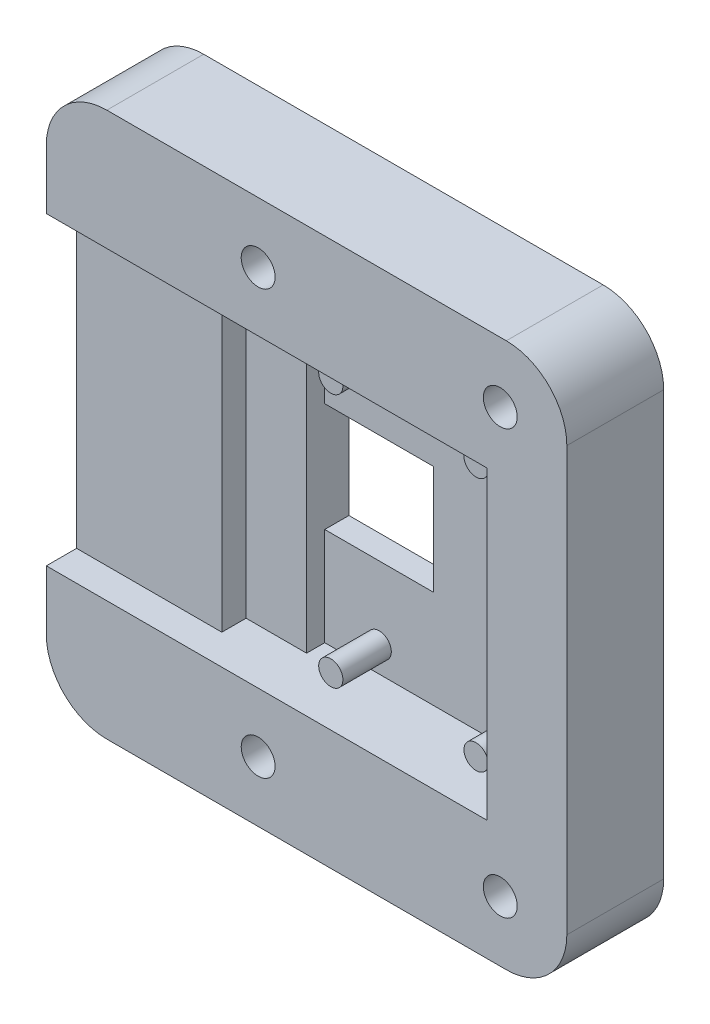
ISO-10303-21;
HEADER;
FILE_DESCRIPTION(('STEP AP214'),'2;1');
FILE_NAME('part.step','',(''),(''),'','','');
FILE_SCHEMA(('AUTOMOTIVE_DESIGN { 1 0 10303 214 1 1 1 1 }'));
ENDSEC;
DATA;
#1=APPLICATION_CONTEXT('core data for automotive mechanical design processes');
#2=APPLICATION_PROTOCOL_DEFINITION('international standard','automotive_design',2000,#1);
#3=PRODUCT_CONTEXT('',#1,'mechanical');
#4=PRODUCT('Part','Part','',(#3));
#5=PRODUCT_RELATED_PRODUCT_CATEGORY('part','',(#4));
#6=PRODUCT_DEFINITION_FORMATION('','',#4);
#7=PRODUCT_DEFINITION_CONTEXT('part definition',#1,'design');
#8=PRODUCT_DEFINITION('design','',#6,#7);
#9=PRODUCT_DEFINITION_SHAPE('','',#8);
#10=(LENGTH_UNIT() NAMED_UNIT(*) SI_UNIT(.MILLI.,.METRE.));
#11=(NAMED_UNIT(*) PLANE_ANGLE_UNIT() SI_UNIT($,.RADIAN.));
#12=(NAMED_UNIT(*) SI_UNIT($,.STERADIAN.) SOLID_ANGLE_UNIT());
#13=UNCERTAINTY_MEASURE_WITH_UNIT(LENGTH_MEASURE(1.E-05),#10,'distance_accuracy_value','');
#14=(GEOMETRIC_REPRESENTATION_CONTEXT(3) GLOBAL_UNCERTAINTY_ASSIGNED_CONTEXT((#13)) GLOBAL_UNIT_ASSIGNED_CONTEXT((#10,
#11,#12)) REPRESENTATION_CONTEXT('',''));
#15=CARTESIAN_POINT('',(0.,0.,0.));
#16=DIRECTION('',(0.,0.,1.));
#17=DIRECTION('',(1.,0.,0.));
#18=AXIS2_PLACEMENT_3D('',#15,#16,#17);
#19=CARTESIAN_POINT('',(0.,0.,3.5));
#20=DIRECTION('',(0.,0.,1.));
#21=DIRECTION('',(1.,0.,0.));
#22=AXIS2_PLACEMENT_3D('',#19,#20,#21);
#23=PLANE('',#22);
#24=DIRECTION('',(-1.,0.,0.));
#25=VECTOR('',#24,1.);
#26=CARTESIAN_POINT('',(0.,12.6,3.5));
#27=LINE('',#26,#25);
#28=CARTESIAN_POINT('',(-10.5,12.6,3.5));
#29=VERTEX_POINT('',#28);
#30=CARTESIAN_POINT('',(-15.5,12.6,3.5));
#31=VERTEX_POINT('',#30);
#32=EDGE_CURVE('E388',#29,#31,#27,.T.);
#33=ORIENTED_EDGE('',*,*,#32,.T.);
#34=DIRECTION('',(0.,1.,0.));
#35=VECTOR('',#34,1.);
#36=CARTESIAN_POINT('',(-15.5,12.6,3.5));
#37=LINE('',#36,#35);
#38=CARTESIAN_POINT('',(-15.5,-12.6,3.5));
#39=VERTEX_POINT('',#38);
#40=EDGE_CURVE('E952',#39,#31,#37,.T.);
#41=ORIENTED_EDGE('',*,*,#40,.F.);
#42=DIRECTION('',(1.,0.,0.));
#43=VECTOR('',#42,1.);
#44=CARTESIAN_POINT('',(0.,-12.6,3.5));
#45=LINE('',#44,#43);
#46=CARTESIAN_POINT('',(-10.5,-12.6,3.5));
#47=VERTEX_POINT('',#46);
#48=EDGE_CURVE('E209',#39,#47,#45,.T.);
#49=ORIENTED_EDGE('',*,*,#48,.T.);
#50=DIRECTION('',(0.,1.,0.));
#51=VECTOR('',#50,1.);
#52=CARTESIAN_POINT('',(-10.5,22.5,3.5));
#53=LINE('',#52,#51);
#54=EDGE_CURVE('E316',#47,#29,#53,.T.);
#55=ORIENTED_EDGE('',*,*,#54,.T.);
#56=EDGE_LOOP('',(#33,#41,#49,#55));
#57=FACE_BOUND('',#56,.T.);
#58=ADVANCED_FACE('F44',(#57),#23,.T.);
#59=CARTESIAN_POINT('',(8.9,12.6,8.));
#60=DIRECTION('',(0.,1.,0.));
#61=DIRECTION('',(-1.,0.,0.));
#62=AXIS2_PLACEMENT_3D('',#59,#60,#61);
#63=PLANE('',#62);
#64=DIRECTION('',(0.,0.,-1.));
#65=VECTOR('',#64,1.);
#66=CARTESIAN_POINT('',(-15.5,12.6,5.5));
#67=LINE('',#66,#65);
#68=CARTESIAN_POINT('',(-15.5,12.6,5.5));
#69=VERTEX_POINT('',#68);
#70=EDGE_CURVE('E201',#69,#31,#67,.T.);
#71=ORIENTED_EDGE('',*,*,#70,.T.);
#72=ORIENTED_EDGE('',*,*,#32,.F.);
#73=DIRECTION('',(0.,0.,1.));
#74=VECTOR('',#73,1.);
#75=CARTESIAN_POINT('',(-10.5,12.6,2.));
#76=LINE('',#75,#74);
#77=CARTESIAN_POINT('',(-10.5,12.6,2.));
#78=VERTEX_POINT('',#77);
#79=EDGE_CURVE('E312',#78,#29,#76,.T.);
#80=ORIENTED_EDGE('',*,*,#79,.F.);
#81=DIRECTION('',(1.,0.,0.));
#82=VECTOR('',#81,1.);
#83=CARTESIAN_POINT('',(8.9,12.6,2.));
#84=LINE('',#83,#82);
#85=CARTESIAN_POINT('',(8.9,12.6,2.));
#86=VERTEX_POINT('',#85);
#87=EDGE_CURVE('E256',#78,#86,#84,.T.);
#88=ORIENTED_EDGE('',*,*,#87,.T.);
#89=DIRECTION('',(0.,0.,-1.));
#90=VECTOR('',#89,1.);
#91=CARTESIAN_POINT('',(8.9,12.6,8.));
#92=LINE('',#91,#90);
#93=CARTESIAN_POINT('',(8.9,12.6,8.));
#94=VERTEX_POINT('',#93);
#95=EDGE_CURVE('E301',#94,#86,#92,.T.);
#96=ORIENTED_EDGE('',*,*,#95,.F.);
#97=DIRECTION('',(1.,0.,0.));
#98=VECTOR('',#97,1.);
#99=CARTESIAN_POINT('',(-27.5,12.6,8.));
#100=LINE('',#99,#98);
#101=CARTESIAN_POINT('',(-27.5,12.6,8.));
#102=VERTEX_POINT('',#101);
#103=EDGE_CURVE('E269',#102,#94,#100,.T.);
#104=ORIENTED_EDGE('',*,*,#103,.F.);
#105=DIRECTION('',(0.,0.,-1.));
#106=VECTOR('',#105,1.);
#107=CARTESIAN_POINT('',(-27.5,12.6,8.));
#108=LINE('',#107,#106);
#109=CARTESIAN_POINT('',(-27.5,12.6,5.5));
#110=VERTEX_POINT('',#109);
#111=EDGE_CURVE('E305',#102,#110,#108,.T.);
#112=ORIENTED_EDGE('',*,*,#111,.T.);
#113=DIRECTION('',(-1.,0.,0.));
#114=VECTOR('',#113,1.);
#115=CARTESIAN_POINT('',(-27.5,12.6,5.5));
#116=LINE('',#115,#114);
#117=EDGE_CURVE('E204',#69,#110,#116,.T.);
#118=ORIENTED_EDGE('',*,*,#117,.F.);
#119=EDGE_LOOP('',(#71,#72,#80,#88,#96,#104,#112,#118));
#120=FACE_BOUND('',#119,.T.);
#121=ADVANCED_FACE('F500',(#120),#63,.F.);
#122=CARTESIAN_POINT('',(-27.5,-12.6,8.));
#123=DIRECTION('',(0.,-1.,0.));
#124=DIRECTION('',(1.,0.,0.));
#125=AXIS2_PLACEMENT_3D('',#122,#123,#124);
#126=PLANE('',#125);
#127=DIRECTION('',(0.,0.,-1.));
#128=VECTOR('',#127,1.);
#129=CARTESIAN_POINT('',(-15.5,-12.6,5.5));
#130=LINE('',#129,#128);
#131=CARTESIAN_POINT('',(-15.5,-12.6,5.5));
#132=VERTEX_POINT('',#131);
#133=EDGE_CURVE('E198',#132,#39,#130,.T.);
#134=ORIENTED_EDGE('',*,*,#133,.F.);
#135=DIRECTION('',(1.,0.,0.));
#136=VECTOR('',#135,1.);
#137=CARTESIAN_POINT('',(-27.5,-12.6,5.5));
#138=LINE('',#137,#136);
#139=CARTESIAN_POINT('',(-27.5,-12.6,5.5));
#140=VERTEX_POINT('',#139);
#141=EDGE_CURVE('E183',#140,#132,#138,.T.);
#142=ORIENTED_EDGE('',*,*,#141,.F.);
#143=DIRECTION('',(0.,0.,-1.));
#144=VECTOR('',#143,1.);
#145=CARTESIAN_POINT('',(-27.5,-12.6,8.));
#146=LINE('',#145,#144);
#147=CARTESIAN_POINT('',(-27.5,-12.6,8.));
#148=VERTEX_POINT('',#147);
#149=EDGE_CURVE('E284',#148,#140,#146,.T.);
#150=ORIENTED_EDGE('',*,*,#149,.F.);
#151=DIRECTION('',(-1.,0.,0.));
#152=VECTOR('',#151,1.);
#153=CARTESIAN_POINT('',(8.9,-12.6,8.));
#154=LINE('',#153,#152);
#155=CARTESIAN_POINT('',(8.9,-12.6,8.));
#156=VERTEX_POINT('',#155);
#157=EDGE_CURVE('E275',#156,#148,#154,.T.);
#158=ORIENTED_EDGE('',*,*,#157,.F.);
#159=DIRECTION('',(0.,0.,-1.));
#160=VECTOR('',#159,1.);
#161=CARTESIAN_POINT('',(8.9,-12.6,8.));
#162=LINE('',#161,#160);
#163=CARTESIAN_POINT('',(8.9,-12.5999999999999,2.));
#164=VERTEX_POINT('',#163);
#165=EDGE_CURVE('E297',#156,#164,#162,.T.);
#166=ORIENTED_EDGE('',*,*,#165,.T.);
#167=DIRECTION('',(-1.,0.,0.));
#168=VECTOR('',#167,1.);
#169=CARTESIAN_POINT('',(-27.5,-12.6,2.));
#170=LINE('',#169,#168);
#171=CARTESIAN_POINT('',(-10.5,-12.5999999999999,2.));
#172=VERTEX_POINT('',#171);
#173=EDGE_CURVE('E262',#164,#172,#170,.T.);
#174=ORIENTED_EDGE('',*,*,#173,.T.);
#175=DIRECTION('',(0.,0.,-1.));
#176=VECTOR('',#175,1.);
#177=CARTESIAN_POINT('',(-10.5,-12.6,2.));
#178=LINE('',#177,#176);
#179=EDGE_CURVE('E309',#47,#172,#178,.T.);
#180=ORIENTED_EDGE('',*,*,#179,.F.);
#181=ORIENTED_EDGE('',*,*,#48,.F.);
#182=EDGE_LOOP('',(#134,#142,#150,#158,#166,#174,#180,#181));
#183=FACE_BOUND('',#182,.T.);
#184=ADVANCED_FACE('F207',(#183),#126,.F.);
#185=CARTESIAN_POINT('',(-10.5,0.,2.));
#186=DIRECTION('',(1.,0.,0.));
#187=DIRECTION('',(0.,1.,0.));
#188=AXIS2_PLACEMENT_3D('',#185,#186,#187);
#189=PLANE('',#188);
#190=DIRECTION('',(0.,1.,0.));
#191=VECTOR('',#190,1.);
#192=CARTESIAN_POINT('',(-10.5,22.5,2.));
#193=LINE('',#192,#191);
#194=CARTESIAN_POINT('',(-10.5,4.5,2.));
#195=VERTEX_POINT('',#194);
#196=EDGE_CURVE('E323',#195,#78,#193,.T.);
#197=ORIENTED_EDGE('',*,*,#196,.T.);
#198=ORIENTED_EDGE('',*,*,#79,.T.);
#199=ORIENTED_EDGE('',*,*,#54,.F.);
#200=ORIENTED_EDGE('',*,*,#179,.T.);
#201=CARTESIAN_POINT('',(-10.5,-4.5,2.));
#202=VERTEX_POINT('',#201);
#203=EDGE_CURVE('E315',#172,#202,#193,.T.);
#204=ORIENTED_EDGE('',*,*,#203,.T.);
#205=DIRECTION('',(0.,0.,-1.));
#206=VECTOR('',#205,1.);
#207=CARTESIAN_POINT('',(-10.5,-4.5,2.));
#208=LINE('',#207,#206);
#209=CARTESIAN_POINT('',(-10.5,-4.5,0.));
#210=VERTEX_POINT('',#209);
#211=EDGE_CURVE('E376',#202,#210,#208,.T.);
#212=ORIENTED_EDGE('',*,*,#211,.T.);
#213=DIRECTION('',(0.,-1.,0.));
#214=VECTOR('',#213,1.);
#215=CARTESIAN_POINT('',(-10.5,0.,0.));
#216=LINE('',#215,#214);
#217=CARTESIAN_POINT('',(-10.5,4.5,0.));
#218=VERTEX_POINT('',#217);
#219=EDGE_CURVE('E356',#218,#210,#216,.T.);
#220=ORIENTED_EDGE('',*,*,#219,.F.);
#221=DIRECTION('',(0.,0.,-1.));
#222=VECTOR('',#221,1.);
#223=CARTESIAN_POINT('',(-10.5,4.5,2.));
#224=LINE('',#223,#222);
#225=EDGE_CURVE('E344',#195,#218,#224,.T.);
#226=ORIENTED_EDGE('',*,*,#225,.F.);
#227=EDGE_LOOP('',(#197,#198,#199,#200,#204,#212,#220,#226));
#228=FACE_BOUND('',#227,.T.);
#229=ADVANCED_FACE('F531',(#228),#189,.T.);
#230=CARTESIAN_POINT('',(0.,0.,2.));
#231=DIRECTION('',(0.,0.,1.));
#232=DIRECTION('',(1.,0.,0.));
#233=AXIS2_PLACEMENT_3D('',#230,#231,#232);
#234=PLANE('',#233);
#235=CARTESIAN_POINT('',(6.,10.5,2.));
#236=DIRECTION('',(0.,0.,1.));
#237=DIRECTION('',(1.,0.,0.));
#238=AXIS2_PLACEMENT_3D('',#235,#236,#237);
#239=CIRCLE('',#238,1.);
#240=CARTESIAN_POINT('',(7.,10.5,2.));
#241=VERTEX_POINT('',#240);
#242=EDGE_CURVE('E248',#241,#241,#239,.T.);
#243=ORIENTED_EDGE('',*,*,#242,.F.);
#244=EDGE_LOOP('',(#243));
#245=FACE_BOUND('',#244,.T.);
#246=CARTESIAN_POINT('',(-6.,10.5,2.));
#247=DIRECTION('',(0.,0.,1.));
#248=DIRECTION('',(1.,0.,0.));
#249=AXIS2_PLACEMENT_3D('',#246,#247,#248);
#250=CIRCLE('',#249,1.);
#251=CARTESIAN_POINT('',(-5.,10.5,2.));
#252=VERTEX_POINT('',#251);
#253=EDGE_CURVE('E324',#252,#252,#250,.T.);
#254=ORIENTED_EDGE('',*,*,#253,.F.);
#255=EDGE_LOOP('',(#254));
#256=FACE_BOUND('',#255,.T.);
#257=CARTESIAN_POINT('',(6.,-10.5,2.));
#258=DIRECTION('',(0.,0.,1.));
#259=DIRECTION('',(1.,0.,0.));
#260=AXIS2_PLACEMENT_3D('',#257,#258,#259);
#261=CIRCLE('',#260,1.);
#262=CARTESIAN_POINT('',(7.,-10.5,2.));
#263=VERTEX_POINT('',#262);
#264=EDGE_CURVE('E340',#263,#263,#261,.T.);
#265=ORIENTED_EDGE('',*,*,#264,.F.);
#266=EDGE_LOOP('',(#265));
#267=FACE_BOUND('',#266,.T.);
#268=CARTESIAN_POINT('',(-6.,-10.5,2.));
#269=DIRECTION('',(0.,0.,1.));
#270=DIRECTION('',(1.,0.,0.));
#271=AXIS2_PLACEMENT_3D('',#268,#269,#270);
#272=CIRCLE('',#271,1.);
#273=CARTESIAN_POINT('',(-5.,-10.5,2.));
#274=VERTEX_POINT('',#273);
#275=EDGE_CURVE('E240',#274,#274,#272,.T.);
#276=ORIENTED_EDGE('',*,*,#275,.F.);
#277=EDGE_LOOP('',(#276));
#278=FACE_BOUND('',#277,.T.);
#279=DIRECTION('',(0.,-1.,0.));
#280=VECTOR('',#279,1.);
#281=CARTESIAN_POINT('',(8.9,12.6,2.));
#282=LINE('',#281,#280);
#283=EDGE_CURVE('E288',#86,#164,#282,.T.);
#284=ORIENTED_EDGE('',*,*,#283,.F.);
#285=ORIENTED_EDGE('',*,*,#87,.F.);
#286=ORIENTED_EDGE('',*,*,#196,.F.);
#287=DIRECTION('',(1.,0.,0.));
#288=VECTOR('',#287,1.);
#289=CARTESIAN_POINT('',(0.,4.5,2.));
#290=LINE('',#289,#288);
#291=CARTESIAN_POINT('',(-1.5,4.5,2.));
#292=VERTEX_POINT('',#291);
#293=EDGE_CURVE('E328',#195,#292,#290,.T.);
#294=ORIENTED_EDGE('',*,*,#293,.T.);
#295=DIRECTION('',(0.,-1.,0.));
#296=VECTOR('',#295,1.);
#297=CARTESIAN_POINT('',(-1.5,0.,2.));
#298=LINE('',#297,#296);
#299=CARTESIAN_POINT('',(-1.5,-4.5,2.));
#300=VERTEX_POINT('',#299);
#301=EDGE_CURVE('E333',#292,#300,#298,.T.);
#302=ORIENTED_EDGE('',*,*,#301,.T.);
#303=DIRECTION('',(1.,0.,0.));
#304=VECTOR('',#303,1.);
#305=CARTESIAN_POINT('',(0.,-4.5,2.));
#306=LINE('',#305,#304);
#307=EDGE_CURVE('E336',#202,#300,#306,.T.);
#308=ORIENTED_EDGE('',*,*,#307,.F.);
#309=ORIENTED_EDGE('',*,*,#203,.F.);
#310=ORIENTED_EDGE('',*,*,#173,.F.);
#311=EDGE_LOOP('',(#284,#285,#286,#294,#302,#308,#309,#310));
#312=FACE_BOUND('',#311,.T.);
#313=ADVANCED_FACE('F528',(#245,#256,#267,#278,#312),#234,.T.);
#314=CARTESIAN_POINT('',(-27.5,0.,2.));
#315=DIRECTION('',(1.,0.,0.));
#316=DIRECTION('',(0.,1.,0.));
#317=AXIS2_PLACEMENT_3D('',#314,#315,#316);
#318=PLANE('',#317);
#319=DIRECTION('',(0.,-1.,0.));
#320=VECTOR('',#319,1.);
#321=CARTESIAN_POINT('',(-27.5,22.5,8.));
#322=LINE('',#321,#320);
#323=CARTESIAN_POINT('',(-27.5,17.5,8.));
#324=VERTEX_POINT('',#323);
#325=EDGE_CURVE('E266',#324,#102,#322,.T.);
#326=ORIENTED_EDGE('',*,*,#325,.F.);
#327=DIRECTION('',(0.,0.,-1.));
#328=VECTOR('',#327,1.);
#329=CARTESIAN_POINT('',(-27.5,17.5,0.));
#330=LINE('',#329,#328);
#331=CARTESIAN_POINT('',(-27.5,17.5,0.));
#332=VERTEX_POINT('',#331);
#333=EDGE_CURVE('E427',#324,#332,#330,.T.);
#334=ORIENTED_EDGE('',*,*,#333,.T.);
#335=DIRECTION('',(0.,-1.,0.));
#336=VECTOR('',#335,1.);
#337=CARTESIAN_POINT('',(-27.5,0.,0.));
#338=LINE('',#337,#336);
#339=CARTESIAN_POINT('',(-27.5,-17.5,0.));
#340=VERTEX_POINT('',#339);
#341=EDGE_CURVE('E360',#332,#340,#338,.T.);
#342=ORIENTED_EDGE('',*,*,#341,.T.);
#343=DIRECTION('',(0.,0.,-1.));
#344=VECTOR('',#343,1.);
#345=CARTESIAN_POINT('',(-27.5,-17.5,2.));
#346=LINE('',#345,#344);
#347=CARTESIAN_POINT('',(-27.5,-17.5,8.));
#348=VERTEX_POINT('',#347);
#349=EDGE_CURVE('E424',#340,#348,#346,.F.);
#350=ORIENTED_EDGE('',*,*,#349,.T.);
#351=DIRECTION('',(0.,-1.,0.));
#352=VECTOR('',#351,1.);
#353=CARTESIAN_POINT('',(-27.5,-22.5000000000001,8.));
#354=LINE('',#353,#352);
#355=EDGE_CURVE('E278',#148,#348,#354,.T.);
#356=ORIENTED_EDGE('',*,*,#355,.F.);
#357=ORIENTED_EDGE('',*,*,#149,.T.);
#358=DIRECTION('',(0.,-1.,0.));
#359=VECTOR('',#358,1.);
#360=CARTESIAN_POINT('',(-27.5,12.6,5.5));
#361=LINE('',#360,#359);
#362=EDGE_CURVE('E189',#110,#140,#361,.T.);
#363=ORIENTED_EDGE('',*,*,#362,.F.);
#364=ORIENTED_EDGE('',*,*,#111,.F.);
#365=EDGE_LOOP('',(#326,#334,#342,#350,#356,#357,#363,#364));
#366=FACE_BOUND('',#365,.T.);
#367=ADVANCED_FACE('F492',(#366),#318,.F.);
#368=CARTESIAN_POINT('',(0.,-22.5,2.));
#369=DIRECTION('',(0.,1.,0.));
#370=DIRECTION('',(0.,0.,1.));
#371=AXIS2_PLACEMENT_3D('',#368,#369,#370);
#372=PLANE('',#371);
#373=DIRECTION('',(1.,0.,0.));
#374=VECTOR('',#373,1.);
#375=CARTESIAN_POINT('',(-15.5,-22.5,8.));
#376=LINE('',#375,#374);
#377=CARTESIAN_POINT('',(-22.5,-22.5,8.));
#378=VERTEX_POINT('',#377);
#379=CARTESIAN_POINT('',(10.5,-22.4999999999999,8.));
#380=VERTEX_POINT('',#379);
#381=EDGE_CURVE('E281',#378,#380,#376,.T.);
#382=ORIENTED_EDGE('',*,*,#381,.F.);
#383=DIRECTION('',(0.,0.,-1.));
#384=VECTOR('',#383,1.);
#385=CARTESIAN_POINT('',(-22.5,-22.5,2.));
#386=LINE('',#385,#384);
#387=CARTESIAN_POINT('',(-22.5,-22.5,0.));
#388=VERTEX_POINT('',#387);
#389=EDGE_CURVE('E463',#378,#388,#386,.T.);
#390=ORIENTED_EDGE('',*,*,#389,.T.);
#391=DIRECTION('',(1.,0.,0.));
#392=VECTOR('',#391,1.);
#393=CARTESIAN_POINT('',(0.,-22.5,0.));
#394=LINE('',#393,#392);
#395=CARTESIAN_POINT('',(10.5,-22.5,0.));
#396=VERTEX_POINT('',#395);
#397=EDGE_CURVE('E364',#388,#396,#394,.T.);
#398=ORIENTED_EDGE('',*,*,#397,.T.);
#399=DIRECTION('',(0.,0.,-1.));
#400=VECTOR('',#399,1.);
#401=CARTESIAN_POINT('',(10.5,-22.5,8.));
#402=LINE('',#401,#400);
#403=EDGE_CURVE('E60',#396,#380,#402,.F.);
#404=ORIENTED_EDGE('',*,*,#403,.T.);
#405=EDGE_LOOP('',(#382,#390,#398,#404));
#406=FACE_BOUND('',#405,.T.);
#407=ADVANCED_FACE('F510',(#406),#372,.F.);
#408=CARTESIAN_POINT('',(15.5,0.,2.));
#409=DIRECTION('',(1.,0.,0.));
#410=DIRECTION('',(0.,1.,0.));
#411=AXIS2_PLACEMENT_3D('',#408,#409,#410);
#412=PLANE('',#411);
#413=DIRECTION('',(0.,1.,0.));
#414=VECTOR('',#413,1.);
#415=CARTESIAN_POINT('',(15.5,-22.5,8.));
#416=LINE('',#415,#414);
#417=CARTESIAN_POINT('',(15.5,-17.5,8.));
#418=VERTEX_POINT('',#417);
#419=CARTESIAN_POINT('',(15.5,17.5,8.));
#420=VERTEX_POINT('',#419);
#421=EDGE_CURVE('E257',#418,#420,#416,.T.);
#422=ORIENTED_EDGE('',*,*,#421,.F.);
#423=DIRECTION('',(0.,0.,-1.));
#424=VECTOR('',#423,1.);
#425=CARTESIAN_POINT('',(15.5,-17.5,0.));
#426=LINE('',#425,#424);
#427=CARTESIAN_POINT('',(15.5,-17.5,0.));
#428=VERTEX_POINT('',#427);
#429=EDGE_CURVE('E12',#418,#428,#426,.T.);
#430=ORIENTED_EDGE('',*,*,#429,.T.);
#431=DIRECTION('',(0.,-1.,0.));
#432=VECTOR('',#431,1.);
#433=CARTESIAN_POINT('',(15.5,0.,0.));
#434=LINE('',#433,#432);
#435=CARTESIAN_POINT('',(15.5,17.5,0.));
#436=VERTEX_POINT('',#435);
#437=EDGE_CURVE('E367',#436,#428,#434,.T.);
#438=ORIENTED_EDGE('',*,*,#437,.F.);
#439=DIRECTION('',(0.,0.,-1.));
#440=VECTOR('',#439,1.);
#441=CARTESIAN_POINT('',(15.5,17.5,2.));
#442=LINE('',#441,#440);
#443=EDGE_CURVE('E53',#436,#420,#442,.F.);
#444=ORIENTED_EDGE('',*,*,#443,.T.);
#445=EDGE_LOOP('',(#422,#430,#438,#444));
#446=FACE_BOUND('',#445,.T.);
#447=ADVANCED_FACE('F471',(#446),#412,.T.);
#448=CARTESIAN_POINT('',(0.,4.5,2.));
#449=DIRECTION('',(0.,1.,0.));
#450=DIRECTION('',(0.,0.,1.));
#451=AXIS2_PLACEMENT_3D('',#448,#449,#450);
#452=PLANE('',#451);
#453=DIRECTION('',(1.,0.,0.));
#454=VECTOR('',#453,1.);
#455=CARTESIAN_POINT('',(0.,4.5,0.));
#456=LINE('',#455,#454);
#457=CARTESIAN_POINT('',(-1.5,4.5,0.));
#458=VERTEX_POINT('',#457);
#459=EDGE_CURVE('E320',#218,#458,#456,.T.);
#460=ORIENTED_EDGE('',*,*,#459,.T.);
#461=DIRECTION('',(0.,0.,-1.));
#462=VECTOR('',#461,1.);
#463=CARTESIAN_POINT('',(-1.5,4.5,2.));
#464=LINE('',#463,#462);
#465=EDGE_CURVE('E382',#292,#458,#464,.T.);
#466=ORIENTED_EDGE('',*,*,#465,.F.);
#467=ORIENTED_EDGE('',*,*,#293,.F.);
#468=ORIENTED_EDGE('',*,*,#225,.T.);
#469=EDGE_LOOP('',(#460,#466,#467,#468));
#470=FACE_BOUND('',#469,.T.);
#471=ADVANCED_FACE('F541',(#470),#452,.F.);
#472=CARTESIAN_POINT('',(-1.5,0.,2.));
#473=DIRECTION('',(1.,0.,0.));
#474=DIRECTION('',(0.,1.,0.));
#475=AXIS2_PLACEMENT_3D('',#472,#473,#474);
#476=PLANE('',#475);
#477=DIRECTION('',(0.,-1.,0.));
#478=VECTOR('',#477,1.);
#479=CARTESIAN_POINT('',(-1.5,0.,0.));
#480=LINE('',#479,#478);
#481=CARTESIAN_POINT('',(-1.5,-4.5,0.));
#482=VERTEX_POINT('',#481);
#483=EDGE_CURVE('E348',#458,#482,#480,.T.);
#484=ORIENTED_EDGE('',*,*,#483,.T.);
#485=DIRECTION('',(0.,0.,-1.));
#486=VECTOR('',#485,1.);
#487=CARTESIAN_POINT('',(-1.5,-4.5,2.));
#488=LINE('',#487,#486);
#489=EDGE_CURVE('E379',#300,#482,#488,.T.);
#490=ORIENTED_EDGE('',*,*,#489,.F.);
#491=ORIENTED_EDGE('',*,*,#301,.F.);
#492=ORIENTED_EDGE('',*,*,#465,.T.);
#493=EDGE_LOOP('',(#484,#490,#491,#492));
#494=FACE_BOUND('',#493,.T.);
#495=ADVANCED_FACE('F551',(#494),#476,.F.);
#496=CARTESIAN_POINT('',(0.,-4.5,2.));
#497=DIRECTION('',(0.,1.,0.));
#498=DIRECTION('',(0.,0.,1.));
#499=AXIS2_PLACEMENT_3D('',#496,#497,#498);
#500=PLANE('',#499);
#501=DIRECTION('',(1.,0.,0.));
#502=VECTOR('',#501,1.);
#503=CARTESIAN_POINT('',(0.,-4.5,0.));
#504=LINE('',#503,#502);
#505=EDGE_CURVE('E352',#210,#482,#504,.T.);
#506=ORIENTED_EDGE('',*,*,#505,.F.);
#507=ORIENTED_EDGE('',*,*,#211,.F.);
#508=ORIENTED_EDGE('',*,*,#307,.T.);
#509=ORIENTED_EDGE('',*,*,#489,.T.);
#510=EDGE_LOOP('',(#506,#507,#508,#509));
#511=FACE_BOUND('',#510,.T.);
#512=ADVANCED_FACE('F538',(#511),#500,.T.);
#513=CARTESIAN_POINT('',(0.,22.5,2.));
#514=DIRECTION('',(0.,1.,0.));
#515=DIRECTION('',(0.,0.,1.));
#516=AXIS2_PLACEMENT_3D('',#513,#514,#515);
#517=PLANE('',#516);
#518=DIRECTION('',(1.,0.,0.));
#519=VECTOR('',#518,1.);
#520=CARTESIAN_POINT('',(0.,22.5,0.));
#521=LINE('',#520,#519);
#522=CARTESIAN_POINT('',(-22.5,22.5,0.));
#523=VERTEX_POINT('',#522);
#524=CARTESIAN_POINT('',(10.5,22.5,0.));
#525=VERTEX_POINT('',#524);
#526=EDGE_CURVE('E329',#523,#525,#521,.T.);
#527=ORIENTED_EDGE('',*,*,#526,.F.);
#528=DIRECTION('',(0.,0.,-1.));
#529=VECTOR('',#528,1.);
#530=CARTESIAN_POINT('',(-22.5,22.5,8.));
#531=LINE('',#530,#529);
#532=CARTESIAN_POINT('',(-22.5,22.5,8.));
#533=VERTEX_POINT('',#532);
#534=EDGE_CURVE('E447',#523,#533,#531,.F.);
#535=ORIENTED_EDGE('',*,*,#534,.T.);
#536=DIRECTION('',(-1.,0.,0.));
#537=VECTOR('',#536,1.);
#538=CARTESIAN_POINT('',(-15.5,22.5,8.));
#539=LINE('',#538,#537);
#540=CARTESIAN_POINT('',(10.5,22.5,8.));
#541=VERTEX_POINT('',#540);
#542=EDGE_CURVE('E261',#541,#533,#539,.T.);
#543=ORIENTED_EDGE('',*,*,#542,.F.);
#544=DIRECTION('',(0.,0.,-1.));
#545=VECTOR('',#544,1.);
#546=CARTESIAN_POINT('',(10.5,22.5,2.));
#547=LINE('',#546,#545);
#548=EDGE_CURVE('E443',#541,#525,#547,.T.);
#549=ORIENTED_EDGE('',*,*,#548,.T.);
#550=EDGE_LOOP('',(#527,#535,#543,#549));
#551=FACE_BOUND('',#550,.T.);
#552=ADVANCED_FACE('F481',(#551),#517,.T.);
#553=CARTESIAN_POINT('',(0.,0.,0.));
#554=DIRECTION('',(0.,0.,1.));
#555=DIRECTION('',(1.,0.,0.));
#556=AXIS2_PLACEMENT_3D('',#553,#554,#555);
#557=PLANE('',#556);
#558=CARTESIAN_POINT('',(10.,17.5,0.));
#559=DIRECTION('',(0.,0.,1.));
#560=DIRECTION('',(1.,0.,0.));
#561=AXIS2_PLACEMENT_3D('',#558,#559,#560);
#562=CIRCLE('',#561,3.40000000000001);
#563=CARTESIAN_POINT('',(13.4,17.5,0.));
#564=VERTEX_POINT('',#563);
#565=EDGE_CURVE('E404',#564,#564,#562,.T.);
#566=ORIENTED_EDGE('',*,*,#565,.T.);
#567=EDGE_LOOP('',(#566));
#568=FACE_BOUND('',#567,.T.);
#569=CARTESIAN_POINT('',(-10.,17.5,0.));
#570=DIRECTION('',(0.,0.,1.));
#571=DIRECTION('',(1.,0.,0.));
#572=AXIS2_PLACEMENT_3D('',#569,#570,#571);
#573=CIRCLE('',#572,3.40000000000001);
#574=CARTESIAN_POINT('',(-6.59999999999999,17.5,0.));
#575=VERTEX_POINT('',#574);
#576=EDGE_CURVE('E400',#575,#575,#573,.T.);
#577=ORIENTED_EDGE('',*,*,#576,.T.);
#578=EDGE_LOOP('',(#577));
#579=FACE_BOUND('',#578,.T.);
#580=CARTESIAN_POINT('',(-10.,-17.5,0.));
#581=DIRECTION('',(0.,0.,1.));
#582=DIRECTION('',(1.,0.,0.));
#583=AXIS2_PLACEMENT_3D('',#580,#581,#582);
#584=CIRCLE('',#583,3.40000000000001);
#585=CARTESIAN_POINT('',(-6.59999999999998,-17.5,0.));
#586=VERTEX_POINT('',#585);
#587=EDGE_CURVE('E396',#586,#586,#584,.T.);
#588=ORIENTED_EDGE('',*,*,#587,.T.);
#589=EDGE_LOOP('',(#588));
#590=FACE_BOUND('',#589,.T.);
#591=CARTESIAN_POINT('',(10.,-17.5,0.));
#592=DIRECTION('',(0.,0.,1.));
#593=DIRECTION('',(1.,0.,0.));
#594=AXIS2_PLACEMENT_3D('',#591,#592,#593);
#595=CIRCLE('',#594,3.40000000000001);
#596=CARTESIAN_POINT('',(13.4,-17.5,0.));
#597=VERTEX_POINT('',#596);
#598=EDGE_CURVE('E392',#597,#597,#595,.T.);
#599=ORIENTED_EDGE('',*,*,#598,.T.);
#600=EDGE_LOOP('',(#599));
#601=FACE_BOUND('',#600,.T.);
#602=ORIENTED_EDGE('',*,*,#459,.F.);
#603=ORIENTED_EDGE('',*,*,#219,.T.);
#604=ORIENTED_EDGE('',*,*,#505,.T.);
#605=ORIENTED_EDGE('',*,*,#483,.F.);
#606=EDGE_LOOP('',(#602,#603,#604,#605));
#607=FACE_BOUND('',#606,.T.);
#608=ORIENTED_EDGE('',*,*,#341,.F.);
#609=CARTESIAN_POINT('',(-22.5,17.5,0.));
#610=DIRECTION('',(0.,0.,1.));
#611=DIRECTION('',(1.,0.,0.));
#612=AXIS2_PLACEMENT_3D('',#609,#610,#611);
#613=CIRCLE('',#612,5.);
#614=EDGE_CURVE('E440',#332,#523,#613,.F.);
#615=ORIENTED_EDGE('',*,*,#614,.T.);
#616=ORIENTED_EDGE('',*,*,#526,.T.);
#617=CARTESIAN_POINT('',(10.5,17.5,0.));
#618=DIRECTION('',(0.,0.,1.));
#619=DIRECTION('',(1.,0.,0.));
#620=AXIS2_PLACEMENT_3D('',#617,#618,#619);
#621=CIRCLE('',#620,5.);
#622=EDGE_CURVE('E431',#525,#436,#621,.F.);
#623=ORIENTED_EDGE('',*,*,#622,.T.);
#624=ORIENTED_EDGE('',*,*,#437,.T.);
#625=CARTESIAN_POINT('',(10.5,-17.5,0.));
#626=DIRECTION('',(0.,0.,1.));
#627=DIRECTION('',(1.,0.,0.));
#628=AXIS2_PLACEMENT_3D('',#625,#626,#627);
#629=CIRCLE('',#628,5.);
#630=EDGE_CURVE('E434',#428,#396,#629,.F.);
#631=ORIENTED_EDGE('',*,*,#630,.T.);
#632=ORIENTED_EDGE('',*,*,#397,.F.);
#633=CARTESIAN_POINT('',(-22.5,-17.5,0.));
#634=DIRECTION('',(0.,0.,1.));
#635=DIRECTION('',(1.,0.,0.));
#636=AXIS2_PLACEMENT_3D('',#633,#634,#635);
#637=CIRCLE('',#636,5.);
#638=EDGE_CURVE('E437',#388,#340,#637,.F.);
#639=ORIENTED_EDGE('',*,*,#638,.T.);
#640=EDGE_LOOP('',(#608,#615,#616,#623,#624,#631,#632,#639));
#641=FACE_BOUND('',#640,.T.);
#642=ADVANCED_FACE('F485',(#568,#579,#590,#601,#607,#641),#557,.F.);
#643=CARTESIAN_POINT('',(8.9,12.6,8.));
#644=DIRECTION('',(1.,0.,0.));
#645=DIRECTION('',(0.,0.,-1.));
#646=AXIS2_PLACEMENT_3D('',#643,#644,#645);
#647=PLANE('',#646);
#648=ORIENTED_EDGE('',*,*,#283,.T.);
#649=ORIENTED_EDGE('',*,*,#165,.F.);
#650=DIRECTION('',(0.,-1.,0.));
#651=VECTOR('',#650,1.);
#652=CARTESIAN_POINT('',(8.9,12.6,8.));
#653=LINE('',#652,#651);
#654=EDGE_CURVE('E272',#94,#156,#653,.T.);
#655=ORIENTED_EDGE('',*,*,#654,.F.);
#656=ORIENTED_EDGE('',*,*,#95,.T.);
#657=EDGE_LOOP('',(#648,#649,#655,#656));
#658=FACE_BOUND('',#657,.T.);
#659=ADVANCED_FACE('F503',(#658),#647,.F.);
#660=CARTESIAN_POINT('',(0.,0.,8.));
#661=DIRECTION('',(0.,0.,-1.));
#662=DIRECTION('',(-1.,0.,0.));
#663=AXIS2_PLACEMENT_3D('',#660,#661,#662);
#664=PLANE('',#663);
#665=CARTESIAN_POINT('',(-10.,-17.5,8.));
#666=DIRECTION('',(0.,0.,1.));
#667=DIRECTION('',(-1.,0.,0.));
#668=AXIS2_PLACEMENT_3D('',#665,#666,#667);
#669=CIRCLE('',#668,1.4);
#670=CARTESIAN_POINT('',(-11.4,-17.5,8.));
#671=VERTEX_POINT('',#670);
#672=EDGE_CURVE('E211',#671,#671,#669,.T.);
#673=ORIENTED_EDGE('',*,*,#672,.F.);
#674=EDGE_LOOP('',(#673));
#675=FACE_BOUND('',#674,.T.);
#676=CARTESIAN_POINT('',(10.,-17.5,8.));
#677=DIRECTION('',(0.,0.,1.));
#678=DIRECTION('',(1.,0.,0.));
#679=AXIS2_PLACEMENT_3D('',#676,#677,#678);
#680=CIRCLE('',#679,1.4);
#681=CARTESIAN_POINT('',(11.4,-17.5,8.));
#682=VERTEX_POINT('',#681);
#683=EDGE_CURVE('E216',#682,#682,#680,.T.);
#684=ORIENTED_EDGE('',*,*,#683,.F.);
#685=EDGE_LOOP('',(#684));
#686=FACE_BOUND('',#685,.T.);
#687=CARTESIAN_POINT('',(10.,17.5,8.));
#688=DIRECTION('',(0.,0.,1.));
#689=DIRECTION('',(-1.,0.,0.));
#690=AXIS2_PLACEMENT_3D('',#687,#688,#689);
#691=CIRCLE('',#690,1.4);
#692=CARTESIAN_POINT('',(8.6,17.5,8.));
#693=VERTEX_POINT('',#692);
#694=EDGE_CURVE('E221',#693,#693,#691,.T.);
#695=ORIENTED_EDGE('',*,*,#694,.F.);
#696=EDGE_LOOP('',(#695));
#697=FACE_BOUND('',#696,.T.);
#698=CARTESIAN_POINT('',(-10.,17.5,8.));
#699=DIRECTION('',(0.,0.,1.));
#700=DIRECTION('',(1.,0.,0.));
#701=AXIS2_PLACEMENT_3D('',#698,#699,#700);
#702=CIRCLE('',#701,1.4);
#703=CARTESIAN_POINT('',(-8.6,17.5,8.));
#704=VERTEX_POINT('',#703);
#705=EDGE_CURVE('E225',#704,#704,#702,.T.);
#706=ORIENTED_EDGE('',*,*,#705,.F.);
#707=EDGE_LOOP('',(#706));
#708=FACE_BOUND('',#707,.T.);
#709=ORIENTED_EDGE('',*,*,#542,.T.);
#710=CARTESIAN_POINT('',(-22.5,17.5,8.));
#711=DIRECTION('',(0.,0.,-1.));
#712=DIRECTION('',(-1.,0.,0.));
#713=AXIS2_PLACEMENT_3D('',#710,#711,#712);
#714=CIRCLE('',#713,5.);
#715=EDGE_CURVE('E458',#533,#324,#714,.F.);
#716=ORIENTED_EDGE('',*,*,#715,.T.);
#717=ORIENTED_EDGE('',*,*,#325,.T.);
#718=ORIENTED_EDGE('',*,*,#103,.T.);
#719=ORIENTED_EDGE('',*,*,#654,.T.);
#720=ORIENTED_EDGE('',*,*,#157,.T.);
#721=ORIENTED_EDGE('',*,*,#355,.T.);
#722=CARTESIAN_POINT('',(-22.5,-17.5,8.));
#723=DIRECTION('',(0.,0.,-1.));
#724=DIRECTION('',(-1.,0.,0.));
#725=AXIS2_PLACEMENT_3D('',#722,#723,#724);
#726=CIRCLE('',#725,5.);
#727=EDGE_CURVE('E67',#348,#378,#726,.F.);
#728=ORIENTED_EDGE('',*,*,#727,.T.);
#729=ORIENTED_EDGE('',*,*,#381,.T.);
#730=CARTESIAN_POINT('',(10.5,-17.5,8.));
#731=DIRECTION('',(0.,0.,-1.));
#732=DIRECTION('',(-1.,0.,0.));
#733=AXIS2_PLACEMENT_3D('',#730,#731,#732);
#734=CIRCLE('',#733,5.);
#735=EDGE_CURVE('E453',#380,#418,#734,.F.);
#736=ORIENTED_EDGE('',*,*,#735,.T.);
#737=ORIENTED_EDGE('',*,*,#421,.T.);
#738=CARTESIAN_POINT('',(10.5,17.5,8.));
#739=DIRECTION('',(0.,0.,-1.));
#740=DIRECTION('',(-1.,0.,0.));
#741=AXIS2_PLACEMENT_3D('',#738,#739,#740);
#742=CIRCLE('',#741,5.);
#743=EDGE_CURVE('E450',#420,#541,#742,.F.);
#744=ORIENTED_EDGE('',*,*,#743,.T.);
#745=EDGE_LOOP('',(#709,#716,#717,#718,#719,#720,#721,#728,#729,#736,#737,#744));
#746=FACE_BOUND('',#745,.T.);
#747=ADVANCED_FACE('F475',(#675,#686,#697,#708,#746),#664,.F.);
#748=CARTESIAN_POINT('',(-6.,10.5,6.));
#749=DIRECTION('',(0.,0.,-1.));
#750=DIRECTION('',(-1.,0.,0.));
#751=AXIS2_PLACEMENT_3D('',#748,#749,#750);
#752=CYLINDRICAL_SURFACE('',#751,1.);
#753=ORIENTED_EDGE('',*,*,#253,.T.);
#754=EDGE_LOOP('',(#753));
#755=FACE_BOUND('',#754,.T.);
#756=CARTESIAN_POINT('',(-6.,10.5,6.));
#757=DIRECTION('',(0.,0.,1.));
#758=DIRECTION('',(1.,0.,0.));
#759=AXIS2_PLACEMENT_3D('',#756,#757,#758);
#760=CIRCLE('',#759,1.);
#761=CARTESIAN_POINT('',(-5.,10.5,6.));
#762=VERTEX_POINT('',#761);
#763=EDGE_CURVE('E252',#762,#762,#760,.T.);
#764=ORIENTED_EDGE('',*,*,#763,.F.);
#765=EDGE_LOOP('',(#764));
#766=FACE_BOUND('',#765,.T.);
#767=ADVANCED_FACE('F640',(#755,#766),#752,.T.);
#768=CARTESIAN_POINT('',(0.,0.,6.));
#769=DIRECTION('',(0.,0.,1.));
#770=DIRECTION('',(1.,0.,0.));
#771=AXIS2_PLACEMENT_3D('',#768,#769,#770);
#772=PLANE('',#771);
#773=ORIENTED_EDGE('',*,*,#763,.T.);
#774=EDGE_LOOP('',(#773));
#775=FACE_BOUND('',#774,.T.);
#776=ADVANCED_FACE('F636',(#775),#772,.T.);
#777=CARTESIAN_POINT('',(6.,10.5,6.));
#778=DIRECTION('',(0.,0.,-1.));
#779=DIRECTION('',(-1.,0.,0.));
#780=AXIS2_PLACEMENT_3D('',#777,#778,#779);
#781=CYLINDRICAL_SURFACE('',#780,1.);
#782=ORIENTED_EDGE('',*,*,#242,.T.);
#783=EDGE_LOOP('',(#782));
#784=FACE_BOUND('',#783,.T.);
#785=CARTESIAN_POINT('',(6.,10.5,6.));
#786=DIRECTION('',(0.,0.,1.));
#787=DIRECTION('',(1.,0.,0.));
#788=AXIS2_PLACEMENT_3D('',#785,#786,#787);
#789=CIRCLE('',#788,1.);
#790=CARTESIAN_POINT('',(7.,10.5,6.));
#791=VERTEX_POINT('',#790);
#792=EDGE_CURVE('E244',#791,#791,#789,.F.);
#793=ORIENTED_EDGE('',*,*,#792,.T.);
#794=EDGE_LOOP('',(#793));
#795=FACE_BOUND('',#794,.T.);
#796=ADVANCED_FACE('F632',(#784,#795),#781,.T.);
#797=CARTESIAN_POINT('',(0.,0.,6.));
#798=DIRECTION('',(0.,0.,1.));
#799=DIRECTION('',(1.,0.,0.));
#800=AXIS2_PLACEMENT_3D('',#797,#798,#799);
#801=PLANE('',#800);
#802=ORIENTED_EDGE('',*,*,#792,.F.);
#803=EDGE_LOOP('',(#802));
#804=FACE_BOUND('',#803,.T.);
#805=ADVANCED_FACE('F628',(#804),#801,.T.);
#806=CARTESIAN_POINT('',(-6.,-10.5,6.));
#807=DIRECTION('',(0.,0.,-1.));
#808=DIRECTION('',(-1.,0.,0.));
#809=AXIS2_PLACEMENT_3D('',#806,#807,#808);
#810=CYLINDRICAL_SURFACE('',#809,1.);
#811=ORIENTED_EDGE('',*,*,#275,.T.);
#812=EDGE_LOOP('',(#811));
#813=FACE_BOUND('',#812,.T.);
#814=CARTESIAN_POINT('',(-6.,-10.5,6.));
#815=DIRECTION('',(0.,0.,1.));
#816=DIRECTION('',(1.,0.,0.));
#817=AXIS2_PLACEMENT_3D('',#814,#815,#816);
#818=CIRCLE('',#817,1.);
#819=CARTESIAN_POINT('',(-5.,-10.5,6.));
#820=VERTEX_POINT('',#819);
#821=EDGE_CURVE('E236',#820,#820,#818,.F.);
#822=ORIENTED_EDGE('',*,*,#821,.T.);
#823=EDGE_LOOP('',(#822));
#824=FACE_BOUND('',#823,.T.);
#825=ADVANCED_FACE('F624',(#813,#824),#810,.T.);
#826=CARTESIAN_POINT('',(0.,0.,6.));
#827=DIRECTION('',(0.,0.,1.));
#828=DIRECTION('',(1.,0.,0.));
#829=AXIS2_PLACEMENT_3D('',#826,#827,#828);
#830=PLANE('',#829);
#831=ORIENTED_EDGE('',*,*,#821,.F.);
#832=EDGE_LOOP('',(#831));
#833=FACE_BOUND('',#832,.T.);
#834=ADVANCED_FACE('F620',(#833),#830,.T.);
#835=CARTESIAN_POINT('',(6.,-10.5,6.));
#836=DIRECTION('',(0.,0.,-1.));
#837=DIRECTION('',(-1.,0.,0.));
#838=AXIS2_PLACEMENT_3D('',#835,#836,#837);
#839=CYLINDRICAL_SURFACE('',#838,1.);
#840=ORIENTED_EDGE('',*,*,#264,.T.);
#841=EDGE_LOOP('',(#840));
#842=FACE_BOUND('',#841,.T.);
#843=CARTESIAN_POINT('',(6.,-10.5,6.));
#844=DIRECTION('',(0.,0.,1.));
#845=DIRECTION('',(1.,0.,0.));
#846=AXIS2_PLACEMENT_3D('',#843,#844,#845);
#847=CIRCLE('',#846,1.);
#848=CARTESIAN_POINT('',(7.,-10.5,6.));
#849=VERTEX_POINT('',#848);
#850=EDGE_CURVE('E232',#849,#849,#847,.T.);
#851=ORIENTED_EDGE('',*,*,#850,.F.);
#852=EDGE_LOOP('',(#851));
#853=FACE_BOUND('',#852,.T.);
#854=ADVANCED_FACE('F616',(#842,#853),#839,.T.);
#855=CARTESIAN_POINT('',(0.,0.,6.));
#856=DIRECTION('',(0.,0.,1.));
#857=DIRECTION('',(1.,0.,0.));
#858=AXIS2_PLACEMENT_3D('',#855,#856,#857);
#859=PLANE('',#858);
#860=ORIENTED_EDGE('',*,*,#850,.T.);
#861=EDGE_LOOP('',(#860));
#862=FACE_BOUND('',#861,.T.);
#863=ADVANCED_FACE('F612',(#862),#859,.T.);
#864=CARTESIAN_POINT('',(-10.,17.5,8.));
#865=DIRECTION('',(0.,0.,-1.));
#866=DIRECTION('',(-1.,0.,0.));
#867=AXIS2_PLACEMENT_3D('',#864,#865,#866);
#868=CYLINDRICAL_SURFACE('',#867,1.4);
#869=CARTESIAN_POINT('',(-10.,17.5,2.00000000000002));
#870=DIRECTION('',(0.,0.,1.));
#871=DIRECTION('',(1.,0.,0.));
#872=AXIS2_PLACEMENT_3D('',#869,#870,#871);
#873=CIRCLE('',#872,1.4);
#874=CARTESIAN_POINT('',(-8.6,17.5,2.00000000000002));
#875=VERTEX_POINT('',#874);
#876=EDGE_CURVE('E412',#875,#875,#873,.F.);
#877=ORIENTED_EDGE('',*,*,#876,.T.);
#878=EDGE_LOOP('',(#877));
#879=FACE_BOUND('',#878,.T.);
#880=ORIENTED_EDGE('',*,*,#705,.T.);
#881=EDGE_LOOP('',(#880));
#882=FACE_BOUND('',#881,.T.);
#883=ADVANCED_FACE('F602',(#879,#882),#868,.F.);
#884=CARTESIAN_POINT('',(10.,17.5,8.));
#885=DIRECTION('',(0.,0.,-1.));
#886=DIRECTION('',(-1.,0.,0.));
#887=AXIS2_PLACEMENT_3D('',#884,#885,#886);
#888=CYLINDRICAL_SURFACE('',#887,1.4);
#889=CARTESIAN_POINT('',(10.,17.5,2.00000000000002));
#890=DIRECTION('',(0.,0.,1.));
#891=DIRECTION('',(1.,0.,0.));
#892=AXIS2_PLACEMENT_3D('',#889,#890,#891);
#893=CIRCLE('',#892,1.4);
#894=CARTESIAN_POINT('',(11.4,17.5,2.00000000000002));
#895=VERTEX_POINT('',#894);
#896=EDGE_CURVE('E408',#895,#895,#893,.F.);
#897=ORIENTED_EDGE('',*,*,#896,.T.);
#898=EDGE_LOOP('',(#897));
#899=FACE_BOUND('',#898,.T.);
#900=ORIENTED_EDGE('',*,*,#694,.T.);
#901=EDGE_LOOP('',(#900));
#902=FACE_BOUND('',#901,.T.);
#903=ADVANCED_FACE('F598',(#899,#902),#888,.F.);
#904=CARTESIAN_POINT('',(10.,-17.5,8.));
#905=DIRECTION('',(0.,0.,-1.));
#906=DIRECTION('',(-1.,0.,0.));
#907=AXIS2_PLACEMENT_3D('',#904,#905,#906);
#908=CYLINDRICAL_SURFACE('',#907,1.4);
#909=CARTESIAN_POINT('',(10.,-17.5,2.00000000000002));
#910=DIRECTION('',(0.,0.,1.));
#911=DIRECTION('',(1.,0.,0.));
#912=AXIS2_PLACEMENT_3D('',#909,#910,#911);
#913=CIRCLE('',#912,1.4);
#914=CARTESIAN_POINT('',(11.4,-17.5,2.00000000000002));
#915=VERTEX_POINT('',#914);
#916=EDGE_CURVE('E420',#915,#915,#913,.F.);
#917=ORIENTED_EDGE('',*,*,#916,.T.);
#918=EDGE_LOOP('',(#917));
#919=FACE_BOUND('',#918,.T.);
#920=ORIENTED_EDGE('',*,*,#683,.T.);
#921=EDGE_LOOP('',(#920));
#922=FACE_BOUND('',#921,.T.);
#923=ADVANCED_FACE('F601',(#919,#922),#908,.F.);
#924=CARTESIAN_POINT('',(-10.,-17.5,8.));
#925=DIRECTION('',(0.,0.,-1.));
#926=DIRECTION('',(-1.,0.,0.));
#927=AXIS2_PLACEMENT_3D('',#924,#925,#926);
#928=CYLINDRICAL_SURFACE('',#927,1.4);
#929=CARTESIAN_POINT('',(-10.,-17.5,2.00000000000002));
#930=DIRECTION('',(0.,0.,1.));
#931=DIRECTION('',(1.,0.,0.));
#932=AXIS2_PLACEMENT_3D('',#929,#930,#931);
#933=CIRCLE('',#932,1.4);
#934=CARTESIAN_POINT('',(-8.6,-17.5,2.00000000000002));
#935=VERTEX_POINT('',#934);
#936=EDGE_CURVE('E416',#935,#935,#933,.F.);
#937=ORIENTED_EDGE('',*,*,#936,.T.);
#938=EDGE_LOOP('',(#937));
#939=FACE_BOUND('',#938,.T.);
#940=ORIENTED_EDGE('',*,*,#672,.T.);
#941=EDGE_LOOP('',(#940));
#942=FACE_BOUND('',#941,.T.);
#943=ADVANCED_FACE('F567',(#939,#942),#928,.F.);
#944=CARTESIAN_POINT('',(10.,17.5,0.));
#945=DIRECTION('',(0.,0.,-1.));
#946=DIRECTION('',(-1.,0.,0.));
#947=AXIS2_PLACEMENT_3D('',#944,#945,#946);
#948=CONICAL_SURFACE('',#947,3.40000000000001,0.785398163397448);
#949=ORIENTED_EDGE('',*,*,#896,.F.);
#950=EDGE_LOOP('',(#949));
#951=FACE_BOUND('',#950,.T.);
#952=ORIENTED_EDGE('',*,*,#565,.F.);
#953=EDGE_LOOP('',(#952));
#954=FACE_BOUND('',#953,.T.);
#955=ADVANCED_FACE('F560',(#951,#954),#948,.F.);
#956=CARTESIAN_POINT('',(-10.,17.5,0.));
#957=DIRECTION('',(0.,0.,-1.));
#958=DIRECTION('',(-1.,0.,0.));
#959=AXIS2_PLACEMENT_3D('',#956,#957,#958);
#960=CONICAL_SURFACE('',#959,3.40000000000001,0.785398163397448);
#961=ORIENTED_EDGE('',*,*,#876,.F.);
#962=EDGE_LOOP('',(#961));
#963=FACE_BOUND('',#962,.T.);
#964=ORIENTED_EDGE('',*,*,#576,.F.);
#965=EDGE_LOOP('',(#964));
#966=FACE_BOUND('',#965,.T.);
#967=ADVANCED_FACE('F566',(#963,#966),#960,.F.);
#968=CARTESIAN_POINT('',(-10.,-17.5,0.));
#969=DIRECTION('',(0.,0.,-1.));
#970=DIRECTION('',(-1.,0.,0.));
#971=AXIS2_PLACEMENT_3D('',#968,#969,#970);
#972=CONICAL_SURFACE('',#971,3.40000000000001,0.785398163397448);
#973=ORIENTED_EDGE('',*,*,#936,.F.);
#974=EDGE_LOOP('',(#973));
#975=FACE_BOUND('',#974,.T.);
#976=ORIENTED_EDGE('',*,*,#587,.F.);
#977=EDGE_LOOP('',(#976));
#978=FACE_BOUND('',#977,.T.);
#979=ADVANCED_FACE('F574',(#975,#978),#972,.F.);
#980=CARTESIAN_POINT('',(10.,-17.5,0.));
#981=DIRECTION('',(0.,0.,-1.));
#982=DIRECTION('',(-1.,0.,0.));
#983=AXIS2_PLACEMENT_3D('',#980,#981,#982);
#984=CONICAL_SURFACE('',#983,3.40000000000001,0.785398163397448);
#985=ORIENTED_EDGE('',*,*,#916,.F.);
#986=EDGE_LOOP('',(#985));
#987=FACE_BOUND('',#986,.T.);
#988=ORIENTED_EDGE('',*,*,#598,.F.);
#989=EDGE_LOOP('',(#988));
#990=FACE_BOUND('',#989,.T.);
#991=ADVANCED_FACE('F581',(#987,#990),#984,.F.);
#992=CARTESIAN_POINT('',(-15.5,12.6,5.5));
#993=DIRECTION('',(-1.,0.,0.));
#994=DIRECTION('',(0.,-1.,0.));
#995=AXIS2_PLACEMENT_3D('',#992,#993,#994);
#996=PLANE('',#995);
#997=ORIENTED_EDGE('',*,*,#40,.T.);
#998=ORIENTED_EDGE('',*,*,#70,.F.);
#999=DIRECTION('',(0.,1.,0.));
#1000=VECTOR('',#999,1.);
#1001=CARTESIAN_POINT('',(-15.5,12.6,5.5));
#1002=LINE('',#1001,#1000);
#1003=EDGE_CURVE('E186',#132,#69,#1002,.T.);
#1004=ORIENTED_EDGE('',*,*,#1003,.F.);
#1005=ORIENTED_EDGE('',*,*,#133,.T.);
#1006=EDGE_LOOP('',(#997,#998,#1004,#1005));
#1007=FACE_BOUND('',#1006,.T.);
#1008=ADVANCED_FACE('F197',(#1007),#996,.F.);
#1009=CARTESIAN_POINT('',(0.,0.,5.5));
#1010=DIRECTION('',(0.,0.,1.));
#1011=DIRECTION('',(1.,0.,0.));
#1012=AXIS2_PLACEMENT_3D('',#1009,#1010,#1011);
#1013=PLANE('',#1012);
#1014=ORIENTED_EDGE('',*,*,#362,.T.);
#1015=ORIENTED_EDGE('',*,*,#141,.T.);
#1016=ORIENTED_EDGE('',*,*,#1003,.T.);
#1017=ORIENTED_EDGE('',*,*,#117,.T.);
#1018=EDGE_LOOP('',(#1014,#1015,#1016,#1017));
#1019=FACE_BOUND('',#1018,.T.);
#1020=ADVANCED_FACE('F185',(#1019),#1013,.T.);
#1021=CARTESIAN_POINT('',(-22.5,17.5,2.));
#1022=DIRECTION('',(0.,0.,1.));
#1023=DIRECTION('',(1.,0.,0.));
#1024=AXIS2_PLACEMENT_3D('',#1021,#1022,#1023);
#1025=CYLINDRICAL_SURFACE('',#1024,5.);
#1026=ORIENTED_EDGE('',*,*,#715,.F.);
#1027=ORIENTED_EDGE('',*,*,#534,.F.);
#1028=ORIENTED_EDGE('',*,*,#614,.F.);
#1029=ORIENTED_EDGE('',*,*,#333,.F.);
#1030=EDGE_LOOP('',(#1026,#1027,#1028,#1029));
#1031=FACE_BOUND('',#1030,.T.);
#1032=ADVANCED_FACE('F489',(#1031),#1025,.T.);
#1033=CARTESIAN_POINT('',(-22.5,-17.5,2.));
#1034=DIRECTION('',(0.,0.,-1.));
#1035=DIRECTION('',(-1.,0.,0.));
#1036=AXIS2_PLACEMENT_3D('',#1033,#1034,#1035);
#1037=CYLINDRICAL_SURFACE('',#1036,5.);
#1038=ORIENTED_EDGE('',*,*,#727,.F.);
#1039=ORIENTED_EDGE('',*,*,#349,.F.);
#1040=ORIENTED_EDGE('',*,*,#638,.F.);
#1041=ORIENTED_EDGE('',*,*,#389,.F.);
#1042=EDGE_LOOP('',(#1038,#1039,#1040,#1041));
#1043=FACE_BOUND('',#1042,.T.);
#1044=ADVANCED_FACE('F508',(#1043),#1037,.T.);
#1045=CARTESIAN_POINT('',(10.5,-17.5,2.));
#1046=DIRECTION('',(0.,0.,1.));
#1047=DIRECTION('',(1.,0.,0.));
#1048=AXIS2_PLACEMENT_3D('',#1045,#1046,#1047);
#1049=CYLINDRICAL_SURFACE('',#1048,5.);
#1050=ORIENTED_EDGE('',*,*,#735,.F.);
#1051=ORIENTED_EDGE('',*,*,#403,.F.);
#1052=ORIENTED_EDGE('',*,*,#630,.F.);
#1053=ORIENTED_EDGE('',*,*,#429,.F.);
#1054=EDGE_LOOP('',(#1050,#1051,#1052,#1053));
#1055=FACE_BOUND('',#1054,.T.);
#1056=ADVANCED_FACE('F512',(#1055),#1049,.T.);
#1057=CARTESIAN_POINT('',(10.5,17.5,2.));
#1058=DIRECTION('',(0.,0.,-1.));
#1059=DIRECTION('',(-1.,0.,0.));
#1060=AXIS2_PLACEMENT_3D('',#1057,#1058,#1059);
#1061=CYLINDRICAL_SURFACE('',#1060,5.);
#1062=ORIENTED_EDGE('',*,*,#743,.F.);
#1063=ORIENTED_EDGE('',*,*,#443,.F.);
#1064=ORIENTED_EDGE('',*,*,#622,.F.);
#1065=ORIENTED_EDGE('',*,*,#548,.F.);
#1066=EDGE_LOOP('',(#1062,#1063,#1064,#1065));
#1067=FACE_BOUND('',#1066,.T.);
#1068=ADVANCED_FACE('F46',(#1067),#1061,.T.);
#1069=CLOSED_SHELL('',(#58,#121,#184,#229,#313,#367,#407,#447,#471,#495,#512,#552,#642,#659,
#747,#767,#776,#796,#805,#825,#834,#854,#863,#883,#903,#923,#943,#955,#967,#979,#991,#1008,
#1020,#1032,#1044,#1056,#1068));
#1070=MANIFOLD_SOLID_BREP('B2',#1069);
#1071=ADVANCED_BREP_SHAPE_REPRESENTATION('',(#18,#1070),#14);
#1072=SHAPE_DEFINITION_REPRESENTATION(#9,#1071);
ENDSEC;
END-ISO-10303-21;
